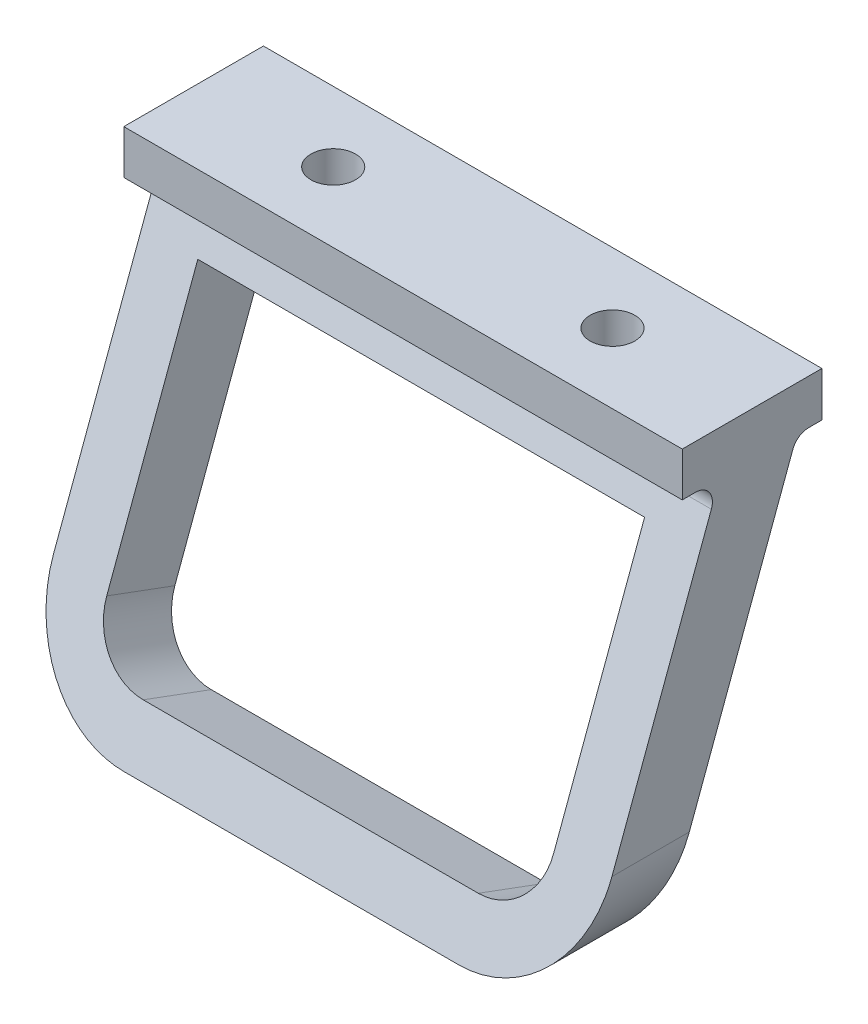
ISO-10303-21;
HEADER;
FILE_DESCRIPTION(('STEP AP214'),'2;1');
FILE_NAME('part.step','',(''),(''),'','','');
FILE_SCHEMA(('AUTOMOTIVE_DESIGN { 1 0 10303 214 1 1 1 1 }'));
ENDSEC;
DATA;
#1=APPLICATION_CONTEXT('core data for automotive mechanical design processes');
#2=APPLICATION_PROTOCOL_DEFINITION('international standard','automotive_design',2000,#1);
#3=PRODUCT_CONTEXT('',#1,'mechanical');
#4=PRODUCT('Part','Part','',(#3));
#5=PRODUCT_RELATED_PRODUCT_CATEGORY('part','',(#4));
#6=PRODUCT_DEFINITION_FORMATION('','',#4);
#7=PRODUCT_DEFINITION_CONTEXT('part definition',#1,'design');
#8=PRODUCT_DEFINITION('design','',#6,#7);
#9=PRODUCT_DEFINITION_SHAPE('','',#8);
#10=(LENGTH_UNIT() NAMED_UNIT(*) SI_UNIT(.MILLI.,.METRE.));
#11=(NAMED_UNIT(*) PLANE_ANGLE_UNIT() SI_UNIT($,.RADIAN.));
#12=(NAMED_UNIT(*) SI_UNIT($,.STERADIAN.) SOLID_ANGLE_UNIT());
#13=UNCERTAINTY_MEASURE_WITH_UNIT(LENGTH_MEASURE(1.E-05),#10,'distance_accuracy_value','');
#14=(GEOMETRIC_REPRESENTATION_CONTEXT(3) GLOBAL_UNCERTAINTY_ASSIGNED_CONTEXT((#13)) GLOBAL_UNIT_ASSIGNED_CONTEXT((#10,
#11,#12)) REPRESENTATION_CONTEXT('',''));
#15=CARTESIAN_POINT('',(0.,0.,0.));
#16=DIRECTION('',(0.,0.,1.));
#17=DIRECTION('',(1.,0.,0.));
#18=AXIS2_PLACEMENT_3D('',#15,#16,#17);
#19=CARTESIAN_POINT('',(20.,20.,0.));
#20=DIRECTION('',(0.,0.,-1.));
#21=DIRECTION('',(0.,1.,0.));
#22=AXIS2_PLACEMENT_3D('',#19,#20,#21);
#23=CYLINDRICAL_SURFACE('',#22,20.);
#24=DIRECTION('',(0.,0.,1.));
#25=VECTOR('',#24,1.);
#26=CARTESIAN_POINT('',(0.,20.,0.));
#27=LINE('',#26,#25);
#28=CARTESIAN_POINT('',(0.,20.,-21.2677631764187));
#29=VERTEX_POINT('',#28);
#30=CARTESIAN_POINT('',(0.,20.,-7.40525976007196));
#31=VERTEX_POINT('',#30);
#32=EDGE_CURVE('E379',#29,#31,#27,.T.);
#33=ORIENTED_EDGE('',*,*,#32,.F.);
#34=CARTESIAN_POINT('',(20.,20.,-21.2677631764187));
#35=DIRECTION('',(0.,-0.347225800382546,-0.937781554280473));
#36=DIRECTION('',(0.,0.937781554280473,-0.347225800382546));
#37=AXIS2_PLACEMENT_3D('',#34,#35,#36);
#38=ELLIPSE('',#37,21.3269283328411,20.);
#39=CARTESIAN_POINT('',(20.,0.,-13.8625034163467));
#40=VERTEX_POINT('',#39);
#41=EDGE_CURVE('E55',#40,#29,#38,.T.);
#42=ORIENTED_EDGE('',*,*,#41,.F.);
#43=DIRECTION('',(0.,0.,1.));
#44=VECTOR('',#43,1.);
#45=CARTESIAN_POINT('',(20.,0.,0.));
#46=LINE('',#45,#44);
#47=CARTESIAN_POINT('',(20.,0.,0.));
#48=VERTEX_POINT('',#47);
#49=EDGE_CURVE('E383',#48,#40,#46,.F.);
#50=ORIENTED_EDGE('',*,*,#49,.F.);
#51=CARTESIAN_POINT('',(20.,20.,-7.40525976007196));
#52=DIRECTION('',(0.,0.347225800382546,0.937781554280473));
#53=DIRECTION('',(0.,0.937781554280473,-0.347225800382546));
#54=AXIS2_PLACEMENT_3D('',#51,#52,#53);
#55=ELLIPSE('',#54,21.3269283328411,20.);
#56=EDGE_CURVE('E11',#31,#48,#55,.T.);
#57=ORIENTED_EDGE('',*,*,#56,.F.);
#58=EDGE_LOOP('',(#33,#42,#50,#57));
#59=FACE_BOUND('',#58,.T.);
#60=ADVANCED_FACE('F47',(#59),#23,.T.);
#61=CARTESIAN_POINT('',(80.,20.,0.));
#62=DIRECTION('',(0.,0.,-1.));
#63=DIRECTION('',(0.,1.,0.));
#64=AXIS2_PLACEMENT_3D('',#61,#62,#63);
#65=CYLINDRICAL_SURFACE('',#64,20.);
#66=DIRECTION('',(0.,0.,-1.));
#67=VECTOR('',#66,1.);
#68=CARTESIAN_POINT('',(100.,20.,0.));
#69=LINE('',#68,#67);
#70=CARTESIAN_POINT('',(100.,20.,-7.40525976007196));
#71=VERTEX_POINT('',#70);
#72=CARTESIAN_POINT('',(100.,20.,-21.2677631764187));
#73=VERTEX_POINT('',#72);
#74=EDGE_CURVE('E365',#71,#73,#69,.T.);
#75=ORIENTED_EDGE('',*,*,#74,.F.);
#76=CARTESIAN_POINT('',(80.,20.,-7.40525976007196));
#77=DIRECTION('',(0.,0.347225800382546,0.937781554280473));
#78=DIRECTION('',(0.,0.937781554280473,-0.347225800382546));
#79=AXIS2_PLACEMENT_3D('',#76,#77,#78);
#80=ELLIPSE('',#79,21.3269283328411,20.);
#81=CARTESIAN_POINT('',(80.,0.,0.));
#82=VERTEX_POINT('',#81);
#83=EDGE_CURVE('E373',#82,#71,#80,.T.);
#84=ORIENTED_EDGE('',*,*,#83,.F.);
#85=DIRECTION('',(0.,0.,-1.));
#86=VECTOR('',#85,1.);
#87=CARTESIAN_POINT('',(80.,0.,0.));
#88=LINE('',#87,#86);
#89=CARTESIAN_POINT('',(80.,0.,-13.8625034163467));
#90=VERTEX_POINT('',#89);
#91=EDGE_CURVE('E369',#90,#82,#88,.F.);
#92=ORIENTED_EDGE('',*,*,#91,.F.);
#93=CARTESIAN_POINT('',(80.,20.,-21.2677631764187));
#94=DIRECTION('',(0.,-0.347225800382546,-0.937781554280473));
#95=DIRECTION('',(0.,0.937781554280473,-0.347225800382546));
#96=AXIS2_PLACEMENT_3D('',#93,#94,#95);
#97=ELLIPSE('',#96,21.3269283328411,20.);
#98=EDGE_CURVE('E376',#73,#90,#97,.T.);
#99=ORIENTED_EDGE('',*,*,#98,.F.);
#100=EDGE_LOOP('',(#75,#84,#92,#99));
#101=FACE_BOUND('',#100,.T.);
#102=ADVANCED_FACE('F412',(#101),#65,.T.);
#103=CARTESIAN_POINT('',(100.,-4.5139354049731,-12.1911602056462));
#104=DIRECTION('',(0.,-0.347225800382546,-0.937781554280473));
#105=DIRECTION('',(0.,0.937781554280473,-0.347225800382546));
#106=AXIS2_PLACEMENT_3D('',#103,#104,#105);
#107=PLANE('',#106);
#108=DIRECTION('',(-1.,0.,0.));
#109=VECTOR('',#108,1.);
#110=CARTESIAN_POINT('',(90.,58.2865197800964,-35.443844390456));
#111=LINE('',#110,#109);
#112=CARTESIAN_POINT('',(90.,58.2865197800964,-35.443844390456));
#113=VERTEX_POINT('',#112);
#114=CARTESIAN_POINT('',(9.99999999999999,58.2865197800963,-35.443844390456));
#115=VERTEX_POINT('',#114);
#116=EDGE_CURVE('E217',#113,#115,#111,.T.);
#117=ORIENTED_EDGE('',*,*,#116,.T.);
#118=DIRECTION('',(0.,-0.937781554280473,0.347225800382546));
#119=VECTOR('',#118,1.);
#120=CARTESIAN_POINT('',(9.99999999999999,58.2865197800963,-35.443844390456));
#121=LINE('',#120,#119);
#122=CARTESIAN_POINT('',(10.,14.2416956806364,-19.1356762132971));
#123=VERTEX_POINT('',#122);
#124=EDGE_CURVE('E246',#115,#123,#121,.T.);
#125=ORIENTED_EDGE('',*,*,#124,.T.);
#126=CARTESIAN_POINT('',(20.,14.2416956806364,-19.1356762132971));
#127=DIRECTION('',(0.,-0.347225800382546,-0.937781554280473));
#128=DIRECTION('',(0.,0.937781554280473,-0.347225800382546));
#129=AXIS2_PLACEMENT_3D('',#126,#127,#128);
#130=CIRCLE('',#129,10.);
#131=CARTESIAN_POINT('',(20.0000000000001,4.86388013783163,-15.6634182094716));
#132=VERTEX_POINT('',#131);
#133=EDGE_CURVE('E201',#123,#132,#130,.F.);
#134=ORIENTED_EDGE('',*,*,#133,.T.);
#135=DIRECTION('',(1.,0.,0.));
#136=VECTOR('',#135,1.);
#137=CARTESIAN_POINT('',(20.0000000000001,4.86388013783163,-15.6634182094716));
#138=LINE('',#137,#136);
#139=CARTESIAN_POINT('',(79.9999999999999,4.86388013783163,-15.6634182094716));
#140=VERTEX_POINT('',#139);
#141=EDGE_CURVE('E205',#132,#140,#138,.T.);
#142=ORIENTED_EDGE('',*,*,#141,.T.);
#143=CARTESIAN_POINT('',(80.,14.2416956806364,-19.1356762132971));
#144=DIRECTION('',(0.,-0.347225800382546,-0.937781554280473));
#145=DIRECTION('',(0.,0.937781554280473,-0.347225800382546));
#146=AXIS2_PLACEMENT_3D('',#143,#144,#145);
#147=CIRCLE('',#146,10.);
#148=CARTESIAN_POINT('',(90.,14.2416956806364,-19.1356762132971));
#149=VERTEX_POINT('',#148);
#150=EDGE_CURVE('E209',#140,#149,#147,.F.);
#151=ORIENTED_EDGE('',*,*,#150,.T.);
#152=DIRECTION('',(0.,0.937781554280473,-0.347225800382546));
#153=VECTOR('',#152,1.);
#154=CARTESIAN_POINT('',(90.,14.2416956806364,-19.1356762132971));
#155=LINE('',#154,#153);
#156=EDGE_CURVE('E213',#149,#113,#155,.T.);
#157=ORIENTED_EDGE('',*,*,#156,.T.);
#158=EDGE_LOOP('',(#117,#125,#134,#142,#151,#157));
#159=FACE_BOUND('',#158,.T.);
#160=DIRECTION('',(-1.,0.,0.));
#161=VECTOR('',#160,1.);
#162=CARTESIAN_POINT('',(100.,0.,-13.8625034163467));
#163=LINE('',#162,#161);
#164=EDGE_CURVE('E299',#90,#40,#163,.T.);
#165=ORIENTED_EDGE('',*,*,#164,.T.);
#166=ORIENTED_EDGE('',*,*,#41,.T.);
#167=DIRECTION('',(0.,-0.937781554280473,0.347225800382546));
#168=VECTOR('',#167,1.);
#169=CARTESIAN_POINT('',(0.,-4.5139354049731,-12.1911602056462));
#170=LINE('',#169,#168);
#171=CARTESIAN_POINT('',(0.,70.0416774011477,-39.7963441756797));
#172=VERTEX_POINT('',#171);
#173=EDGE_CURVE('E263',#172,#29,#170,.T.);
#174=ORIENTED_EDGE('',*,*,#173,.F.);
#175=DIRECTION('',(-1.,0.,0.));
#176=VECTOR('',#175,1.);
#177=CARTESIAN_POINT('',(100.,70.0416774011477,-39.7963441756797));
#178=LINE('',#177,#176);
#179=CARTESIAN_POINT('',(100.,70.0416774011477,-39.7963441756797));
#180=VERTEX_POINT('',#179);
#181=EDGE_CURVE('E362',#180,#172,#178,.T.);
#182=ORIENTED_EDGE('',*,*,#181,.F.);
#183=DIRECTION('',(0.,-0.937781554280473,0.347225800382546));
#184=VECTOR('',#183,1.);
#185=CARTESIAN_POINT('',(100.,-4.5139354049731,-12.1911602056462));
#186=LINE('',#185,#184);
#187=EDGE_CURVE('E264',#180,#73,#186,.T.);
#188=ORIENTED_EDGE('',*,*,#187,.T.);
#189=ORIENTED_EDGE('',*,*,#98,.T.);
#190=EDGE_LOOP('',(#165,#166,#174,#182,#188,#189));
#191=FACE_BOUND('',#190,.T.);
#192=ADVANCED_FACE('F390',(#159,#191),#107,.T.);
#193=CARTESIAN_POINT('',(100.,69.,-42.6096888385212));
#194=DIRECTION('',(-1.,0.,0.));
#195=DIRECTION('',(0.,0.,1.));
#196=AXIS2_PLACEMENT_3D('',#193,#194,#195);
#197=CYLINDRICAL_SURFACE('',#196,3.00000000000001);
#198=CARTESIAN_POINT('',(0.,69.,-42.6096888385212));
#199=DIRECTION('',(1.,0.,0.));
#200=DIRECTION('',(0.,0.,-1.));
#201=AXIS2_PLACEMENT_3D('',#198,#199,#200);
#202=CIRCLE('',#201,3.00000000000001);
#203=CARTESIAN_POINT('',(0.,72.,-42.6096888385212));
#204=VERTEX_POINT('',#203);
#205=EDGE_CURVE('E303',#172,#204,#202,.F.);
#206=ORIENTED_EDGE('',*,*,#205,.T.);
#207=DIRECTION('',(-1.,0.,0.));
#208=VECTOR('',#207,1.);
#209=CARTESIAN_POINT('',(100.,72.,-42.6096888385212));
#210=LINE('',#209,#208);
#211=CARTESIAN_POINT('',(100.,72.,-42.6096888385212));
#212=VERTEX_POINT('',#211);
#213=EDGE_CURVE('E359',#212,#204,#210,.T.);
#214=ORIENTED_EDGE('',*,*,#213,.F.);
#215=CARTESIAN_POINT('',(100.,69.,-42.6096888385212));
#216=DIRECTION('',(1.,0.,0.));
#217=DIRECTION('',(0.,0.,-1.));
#218=AXIS2_PLACEMENT_3D('',#215,#216,#217);
#219=CIRCLE('',#218,3.00000000000001);
#220=EDGE_CURVE('E268',#180,#212,#219,.F.);
#221=ORIENTED_EDGE('',*,*,#220,.F.);
#222=ORIENTED_EDGE('',*,*,#181,.T.);
#223=EDGE_LOOP('',(#206,#214,#221,#222));
#224=FACE_BOUND('',#223,.T.);
#225=ADVANCED_FACE('F401',(#224),#197,.F.);
#226=CARTESIAN_POINT('',(100.,72.,0.));
#227=DIRECTION('',(0.,-1.,0.));
#228=DIRECTION('',(0.,0.,-1.));
#229=AXIS2_PLACEMENT_3D('',#226,#227,#228);
#230=PLANE('',#229);
#231=DIRECTION('',(0.,0.,1.));
#232=VECTOR('',#231,1.);
#233=CARTESIAN_POINT('',(0.,72.,0.));
#234=LINE('',#233,#232);
#235=CARTESIAN_POINT('',(0.,72.,-45.));
#236=VERTEX_POINT('',#235);
#237=EDGE_CURVE('E307',#236,#204,#234,.T.);
#238=ORIENTED_EDGE('',*,*,#237,.F.);
#239=DIRECTION('',(-1.,0.,0.));
#240=VECTOR('',#239,1.);
#241=CARTESIAN_POINT('',(100.,72.,-45.));
#242=LINE('',#241,#240);
#243=CARTESIAN_POINT('',(100.,72.,-45.));
#244=VERTEX_POINT('',#243);
#245=EDGE_CURVE('E356',#244,#236,#242,.T.);
#246=ORIENTED_EDGE('',*,*,#245,.F.);
#247=DIRECTION('',(0.,0.,1.));
#248=VECTOR('',#247,1.);
#249=CARTESIAN_POINT('',(100.,72.,0.));
#250=LINE('',#249,#248);
#251=EDGE_CURVE('E272',#244,#212,#250,.T.);
#252=ORIENTED_EDGE('',*,*,#251,.T.);
#253=ORIENTED_EDGE('',*,*,#213,.T.);
#254=EDGE_LOOP('',(#238,#246,#252,#253));
#255=FACE_BOUND('',#254,.T.);
#256=ADVANCED_FACE('F439',(#255),#230,.T.);
#257=CARTESIAN_POINT('',(100.,0.,-44.9999999999999));
#258=DIRECTION('',(0.,0.,-1.));
#259=DIRECTION('',(0.,1.,0.));
#260=AXIS2_PLACEMENT_3D('',#257,#258,#259);
#261=PLANE('',#260);
#262=DIRECTION('',(0.,-1.,0.));
#263=VECTOR('',#262,1.);
#264=CARTESIAN_POINT('',(0.,0.,-44.9999999999999));
#265=LINE('',#264,#263);
#266=CARTESIAN_POINT('',(0.,80.,-45.));
#267=VERTEX_POINT('',#266);
#268=EDGE_CURVE('E311',#267,#236,#265,.T.);
#269=ORIENTED_EDGE('',*,*,#268,.F.);
#270=DIRECTION('',(-1.,0.,0.));
#271=VECTOR('',#270,1.);
#272=CARTESIAN_POINT('',(100.,80.,-45.));
#273=LINE('',#272,#271);
#274=CARTESIAN_POINT('',(100.,80.,-45.));
#275=VERTEX_POINT('',#274);
#276=EDGE_CURVE('E353',#275,#267,#273,.T.);
#277=ORIENTED_EDGE('',*,*,#276,.F.);
#278=DIRECTION('',(0.,-1.,0.));
#279=VECTOR('',#278,1.);
#280=CARTESIAN_POINT('',(100.,0.,-44.9999999999999));
#281=LINE('',#280,#279);
#282=EDGE_CURVE('E276',#275,#244,#281,.T.);
#283=ORIENTED_EDGE('',*,*,#282,.T.);
#284=ORIENTED_EDGE('',*,*,#245,.T.);
#285=EDGE_LOOP('',(#269,#277,#283,#284));
#286=FACE_BOUND('',#285,.T.);
#287=ADVANCED_FACE('F437',(#286),#261,.T.);
#288=CARTESIAN_POINT('',(100.,80.,0.));
#289=DIRECTION('',(0.,1.,0.));
#290=DIRECTION('',(0.,0.,1.));
#291=AXIS2_PLACEMENT_3D('',#288,#289,#290);
#292=PLANE('',#291);
#293=CARTESIAN_POINT('',(25.,80.,-32.5));
#294=DIRECTION('',(0.,1.,0.));
#295=DIRECTION('',(0.,0.,1.));
#296=AXIS2_PLACEMENT_3D('',#293,#294,#295);
#297=CIRCLE('',#296,4.);
#298=CARTESIAN_POINT('',(25.,80.,-28.5));
#299=VERTEX_POINT('',#298);
#300=EDGE_CURVE('E188',#299,#299,#297,.T.);
#301=ORIENTED_EDGE('',*,*,#300,.F.);
#302=EDGE_LOOP('',(#301));
#303=FACE_BOUND('',#302,.T.);
#304=CARTESIAN_POINT('',(75.,80.,-32.5));
#305=DIRECTION('',(0.,1.,0.));
#306=DIRECTION('',(0.,0.,1.));
#307=AXIS2_PLACEMENT_3D('',#304,#305,#306);
#308=CIRCLE('',#307,4.);
#309=CARTESIAN_POINT('',(75.,80.,-28.5));
#310=VERTEX_POINT('',#309);
#311=EDGE_CURVE('E187',#310,#310,#308,.T.);
#312=ORIENTED_EDGE('',*,*,#311,.F.);
#313=EDGE_LOOP('',(#312));
#314=FACE_BOUND('',#313,.T.);
#315=DIRECTION('',(0.,0.,-1.));
#316=VECTOR('',#315,1.);
#317=CARTESIAN_POINT('',(0.,80.,0.));
#318=LINE('',#317,#316);
#319=CARTESIAN_POINT('',(0.,80.,-20.));
#320=VERTEX_POINT('',#319);
#321=EDGE_CURVE('E315',#320,#267,#318,.T.);
#322=ORIENTED_EDGE('',*,*,#321,.F.);
#323=DIRECTION('',(-1.,0.,0.));
#324=VECTOR('',#323,1.);
#325=CARTESIAN_POINT('',(100.,80.,-20.));
#326=LINE('',#325,#324);
#327=CARTESIAN_POINT('',(100.,80.,-20.));
#328=VERTEX_POINT('',#327);
#329=EDGE_CURVE('E350',#328,#320,#326,.T.);
#330=ORIENTED_EDGE('',*,*,#329,.F.);
#331=DIRECTION('',(0.,0.,-1.));
#332=VECTOR('',#331,1.);
#333=CARTESIAN_POINT('',(100.,80.,0.));
#334=LINE('',#333,#332);
#335=EDGE_CURVE('E280',#328,#275,#334,.T.);
#336=ORIENTED_EDGE('',*,*,#335,.T.);
#337=ORIENTED_EDGE('',*,*,#276,.T.);
#338=EDGE_LOOP('',(#322,#330,#336,#337));
#339=FACE_BOUND('',#338,.T.);
#340=ADVANCED_FACE('F433',(#303,#314,#339),#292,.T.);
#341=CARTESIAN_POINT('',(100.,0.,-20.0000000000001));
#342=DIRECTION('',(0.,0.,1.));
#343=DIRECTION('',(0.,-1.,0.));
#344=AXIS2_PLACEMENT_3D('',#341,#342,#343);
#345=PLANE('',#344);
#346=DIRECTION('',(0.,1.,0.));
#347=VECTOR('',#346,1.);
#348=CARTESIAN_POINT('',(0.,0.,-20.0000000000001));
#349=LINE('',#348,#347);
#350=CARTESIAN_POINT('',(0.,72.1112837104753,-20.));
#351=VERTEX_POINT('',#350);
#352=EDGE_CURVE('E319',#351,#320,#349,.T.);
#353=ORIENTED_EDGE('',*,*,#352,.F.);
#354=DIRECTION('',(-1.,0.,0.));
#355=VECTOR('',#354,1.);
#356=CARTESIAN_POINT('',(100.,72.1112837104753,-20.));
#357=LINE('',#356,#355);
#358=CARTESIAN_POINT('',(100.,72.1112837104753,-20.));
#359=VERTEX_POINT('',#358);
#360=EDGE_CURVE('E347',#359,#351,#357,.T.);
#361=ORIENTED_EDGE('',*,*,#360,.F.);
#362=DIRECTION('',(0.,1.,0.));
#363=VECTOR('',#362,1.);
#364=CARTESIAN_POINT('',(100.,0.,-20.0000000000001));
#365=LINE('',#364,#363);
#366=EDGE_CURVE('E284',#359,#328,#365,.T.);
#367=ORIENTED_EDGE('',*,*,#366,.T.);
#368=ORIENTED_EDGE('',*,*,#329,.T.);
#369=EDGE_LOOP('',(#353,#361,#367,#368));
#370=FACE_BOUND('',#369,.T.);
#371=ADVANCED_FACE('F429',(#370),#345,.T.);
#372=CARTESIAN_POINT('',(100.,72.1112837104753,0.));
#373=DIRECTION('',(0.,-1.,0.));
#374=DIRECTION('',(0.,0.,-1.));
#375=AXIS2_PLACEMENT_3D('',#372,#373,#374);
#376=PLANE('',#375);
#377=DIRECTION('',(0.,0.,1.));
#378=VECTOR('',#377,1.);
#379=CARTESIAN_POINT('',(0.,72.1112837104753,0.));
#380=LINE('',#379,#378);
#381=CARTESIAN_POINT('',(0.,72.1112837104753,-22.3903111614788));
#382=VERTEX_POINT('',#381);
#383=EDGE_CURVE('E323',#382,#351,#380,.T.);
#384=ORIENTED_EDGE('',*,*,#383,.F.);
#385=DIRECTION('',(-1.,0.,0.));
#386=VECTOR('',#385,1.);
#387=CARTESIAN_POINT('',(100.,72.1112837104753,-22.3903111614788));
#388=LINE('',#387,#386);
#389=CARTESIAN_POINT('',(100.,72.1112837104753,-22.3903111614788));
#390=VERTEX_POINT('',#389);
#391=EDGE_CURVE('E344',#390,#382,#388,.T.);
#392=ORIENTED_EDGE('',*,*,#391,.F.);
#393=DIRECTION('',(0.,0.,1.));
#394=VECTOR('',#393,1.);
#395=CARTESIAN_POINT('',(100.,72.1112837104753,0.));
#396=LINE('',#395,#394);
#397=EDGE_CURVE('E288',#390,#359,#396,.T.);
#398=ORIENTED_EDGE('',*,*,#397,.T.);
#399=ORIENTED_EDGE('',*,*,#360,.T.);
#400=EDGE_LOOP('',(#384,#392,#398,#399));
#401=FACE_BOUND('',#400,.T.);
#402=ADVANCED_FACE('F425',(#401),#376,.T.);
#403=CARTESIAN_POINT('',(100.,69.1112837104753,-22.3903111614788));
#404=DIRECTION('',(-1.,0.,0.));
#405=DIRECTION('',(0.,0.,1.));
#406=AXIS2_PLACEMENT_3D('',#403,#404,#405);
#407=CYLINDRICAL_SURFACE('',#406,3.);
#408=CARTESIAN_POINT('',(0.,69.1112837104753,-22.3903111614788));
#409=DIRECTION('',(1.,0.,0.));
#410=DIRECTION('',(0.,0.,-1.));
#411=AXIS2_PLACEMENT_3D('',#408,#409,#410);
#412=CIRCLE('',#411,3.);
#413=CARTESIAN_POINT('',(0.,68.0696063093277,-25.2036558243202));
#414=VERTEX_POINT('',#413);
#415=EDGE_CURVE('E327',#414,#382,#412,.T.);
#416=ORIENTED_EDGE('',*,*,#415,.F.);
#417=DIRECTION('',(-1.,0.,0.));
#418=VECTOR('',#417,1.);
#419=CARTESIAN_POINT('',(100.,68.0696063093277,-25.2036558243202));
#420=LINE('',#419,#418);
#421=CARTESIAN_POINT('',(100.,68.0696063093277,-25.2036558243202));
#422=VERTEX_POINT('',#421);
#423=EDGE_CURVE('E340',#422,#414,#420,.T.);
#424=ORIENTED_EDGE('',*,*,#423,.F.);
#425=CARTESIAN_POINT('',(100.,69.1112837104753,-22.3903111614788));
#426=DIRECTION('',(1.,0.,0.));
#427=DIRECTION('',(0.,0.,-1.));
#428=AXIS2_PLACEMENT_3D('',#425,#426,#427);
#429=CIRCLE('',#428,3.);
#430=EDGE_CURVE('E292',#422,#390,#429,.T.);
#431=ORIENTED_EDGE('',*,*,#430,.T.);
#432=ORIENTED_EDGE('',*,*,#391,.T.);
#433=EDGE_LOOP('',(#416,#424,#431,#432));
#434=FACE_BOUND('',#433,.T.);
#435=ADVANCED_FACE('F422',(#434),#407,.F.);
#436=CARTESIAN_POINT('',(100.,0.,0.));
#437=DIRECTION('',(0.,0.347225800382546,0.937781554280473));
#438=DIRECTION('',(0.,-0.937781554280473,0.347225800382546));
#439=AXIS2_PLACEMENT_3D('',#436,#437,#438);
#440=PLANE('',#439);
#441=DIRECTION('',(-1.,0.,0.));
#442=VECTOR('',#441,1.);
#443=CARTESIAN_POINT('',(90.,62.8004551850695,-23.2526841848099));
#444=LINE('',#443,#442);
#445=CARTESIAN_POINT('',(90.,62.8004551850695,-23.2526841848099));
#446=VERTEX_POINT('',#445);
#447=CARTESIAN_POINT('',(9.99999999999999,62.8004551850694,-23.2526841848098));
#448=VERTEX_POINT('',#447);
#449=EDGE_CURVE('E70',#446,#448,#444,.T.);
#450=ORIENTED_EDGE('',*,*,#449,.F.);
#451=DIRECTION('',(0.,0.937781554280473,-0.347225800382546));
#452=VECTOR('',#451,1.);
#453=CARTESIAN_POINT('',(90.,18.7556310856095,-6.94451600765095));
#454=LINE('',#453,#452);
#455=CARTESIAN_POINT('',(90.,18.7556310856095,-6.94451600765095));
#456=VERTEX_POINT('',#455);
#457=EDGE_CURVE('E238',#456,#446,#454,.T.);
#458=ORIENTED_EDGE('',*,*,#457,.F.);
#459=CARTESIAN_POINT('',(80.,18.7556310856095,-6.94451600765093));
#460=DIRECTION('',(0.,0.347225800382546,0.937781554280473));
#461=DIRECTION('',(0.,-0.937781554280473,0.347225800382546));
#462=AXIS2_PLACEMENT_3D('',#459,#460,#461);
#463=CIRCLE('',#462,10.);
#464=CARTESIAN_POINT('',(79.9999999999999,9.37781554280473,-3.47225800382546));
#465=VERTEX_POINT('',#464);
#466=EDGE_CURVE('E234',#465,#456,#463,.T.);
#467=ORIENTED_EDGE('',*,*,#466,.F.);
#468=DIRECTION('',(1.,0.,0.));
#469=VECTOR('',#468,1.);
#470=CARTESIAN_POINT('',(20.0000000000001,9.37781554280473,-3.47225800382546));
#471=LINE('',#470,#469);
#472=CARTESIAN_POINT('',(20.0000000000001,9.37781554280473,-3.47225800382546));
#473=VERTEX_POINT('',#472);
#474=EDGE_CURVE('E230',#473,#465,#471,.T.);
#475=ORIENTED_EDGE('',*,*,#474,.F.);
#476=CARTESIAN_POINT('',(20.,18.7556310856095,-6.94451600765093));
#477=DIRECTION('',(0.,0.347225800382546,0.937781554280473));
#478=DIRECTION('',(0.,0.937781554280473,-0.347225800382546));
#479=AXIS2_PLACEMENT_3D('',#476,#477,#478);
#480=CIRCLE('',#479,10.);
#481=CARTESIAN_POINT('',(10.,18.7556310856095,-6.94451600765095));
#482=VERTEX_POINT('',#481);
#483=EDGE_CURVE('E226',#482,#473,#480,.T.);
#484=ORIENTED_EDGE('',*,*,#483,.F.);
#485=DIRECTION('',(0.,-0.937781554280473,0.347225800382546));
#486=VECTOR('',#485,1.);
#487=CARTESIAN_POINT('',(9.99999999999999,62.8004551850694,-23.2526841848099));
#488=LINE('',#487,#486);
#489=EDGE_CURVE('E223',#448,#482,#488,.T.);
#490=ORIENTED_EDGE('',*,*,#489,.F.);
#491=EDGE_LOOP('',(#450,#458,#467,#475,#484,#490));
#492=FACE_BOUND('',#491,.T.);
#493=DIRECTION('',(0.,0.937781554280473,-0.347225800382546));
#494=VECTOR('',#493,1.);
#495=CARTESIAN_POINT('',(0.,0.,0.));
#496=LINE('',#495,#494);
#497=EDGE_CURVE('E269',#31,#414,#496,.T.);
#498=ORIENTED_EDGE('',*,*,#497,.F.);
#499=ORIENTED_EDGE('',*,*,#56,.T.);
#500=DIRECTION('',(-1.,0.,0.));
#501=VECTOR('',#500,1.);
#502=CARTESIAN_POINT('',(100.,0.,0.));
#503=LINE('',#502,#501);
#504=EDGE_CURVE('E336',#82,#48,#503,.T.);
#505=ORIENTED_EDGE('',*,*,#504,.F.);
#506=ORIENTED_EDGE('',*,*,#83,.T.);
#507=DIRECTION('',(0.,0.937781554280473,-0.347225800382546));
#508=VECTOR('',#507,1.);
#509=CARTESIAN_POINT('',(100.,0.,0.));
#510=LINE('',#509,#508);
#511=EDGE_CURVE('E296',#71,#422,#510,.T.);
#512=ORIENTED_EDGE('',*,*,#511,.T.);
#513=ORIENTED_EDGE('',*,*,#423,.T.);
#514=EDGE_LOOP('',(#498,#499,#505,#506,#512,#513));
#515=FACE_BOUND('',#514,.T.);
#516=ADVANCED_FACE('F417',(#492,#515),#440,.T.);
#517=CARTESIAN_POINT('',(100.,0.,0.));
#518=DIRECTION('',(0.,-1.,0.));
#519=DIRECTION('',(0.,0.,-1.));
#520=AXIS2_PLACEMENT_3D('',#517,#518,#519);
#521=PLANE('',#520);
#522=ORIENTED_EDGE('',*,*,#504,.T.);
#523=ORIENTED_EDGE('',*,*,#49,.T.);
#524=ORIENTED_EDGE('',*,*,#164,.F.);
#525=ORIENTED_EDGE('',*,*,#91,.T.);
#526=EDGE_LOOP('',(#522,#523,#524,#525));
#527=FACE_BOUND('',#526,.T.);
#528=ADVANCED_FACE('F415',(#527),#521,.T.);
#529=CARTESIAN_POINT('',(100.,0.,0.));
#530=DIRECTION('',(1.,0.,0.));
#531=DIRECTION('',(0.,0.,-1.));
#532=AXIS2_PLACEMENT_3D('',#529,#530,#531);
#533=PLANE('',#532);
#534=ORIENTED_EDGE('',*,*,#511,.F.);
#535=ORIENTED_EDGE('',*,*,#74,.T.);
#536=ORIENTED_EDGE('',*,*,#187,.F.);
#537=ORIENTED_EDGE('',*,*,#220,.T.);
#538=ORIENTED_EDGE('',*,*,#251,.F.);
#539=ORIENTED_EDGE('',*,*,#282,.F.);
#540=ORIENTED_EDGE('',*,*,#335,.F.);
#541=ORIENTED_EDGE('',*,*,#366,.F.);
#542=ORIENTED_EDGE('',*,*,#397,.F.);
#543=ORIENTED_EDGE('',*,*,#430,.F.);
#544=EDGE_LOOP('',(#534,#535,#536,#537,#538,#539,#540,#541,#542,#543));
#545=FACE_BOUND('',#544,.T.);
#546=ADVANCED_FACE('F407',(#545),#533,.T.);
#547=CARTESIAN_POINT('',(0.,0.,0.));
#548=DIRECTION('',(1.,0.,0.));
#549=DIRECTION('',(0.,0.,-1.));
#550=AXIS2_PLACEMENT_3D('',#547,#548,#549);
#551=PLANE('',#550);
#552=ORIENTED_EDGE('',*,*,#173,.T.);
#553=ORIENTED_EDGE('',*,*,#32,.T.);
#554=ORIENTED_EDGE('',*,*,#497,.T.);
#555=ORIENTED_EDGE('',*,*,#415,.T.);
#556=ORIENTED_EDGE('',*,*,#383,.T.);
#557=ORIENTED_EDGE('',*,*,#352,.T.);
#558=ORIENTED_EDGE('',*,*,#321,.T.);
#559=ORIENTED_EDGE('',*,*,#268,.T.);
#560=ORIENTED_EDGE('',*,*,#237,.T.);
#561=ORIENTED_EDGE('',*,*,#205,.F.);
#562=EDGE_LOOP('',(#552,#553,#554,#555,#556,#557,#558,#559,#560,#561));
#563=FACE_BOUND('',#562,.T.);
#564=ADVANCED_FACE('F397',(#563),#551,.F.);
#565=CARTESIAN_POINT('',(90.,48.1470212127561,-62.8284302006957));
#566=DIRECTION('',(0.,0.937781554280473,-0.347225800382546));
#567=DIRECTION('',(0.,0.347225800382546,0.937781554280473));
#568=AXIS2_PLACEMENT_3D('',#565,#566,#567);
#569=PLANE('',#568);
#570=DIRECTION('',(0.,0.347225800382546,0.937781554280473));
#571=VECTOR('',#570,1.);
#572=CARTESIAN_POINT('',(90.,48.1470212127561,-62.8284302006957));
#573=LINE('',#572,#571);
#574=EDGE_CURVE('E243',#113,#446,#573,.T.);
#575=ORIENTED_EDGE('',*,*,#574,.T.);
#576=ORIENTED_EDGE('',*,*,#449,.T.);
#577=DIRECTION('',(0.,0.347225800382546,0.937781554280473));
#578=VECTOR('',#577,1.);
#579=CARTESIAN_POINT('',(9.99999999999999,48.1470212127561,-62.8284302006957));
#580=LINE('',#579,#578);
#581=EDGE_CURVE('E242',#115,#448,#580,.T.);
#582=ORIENTED_EDGE('',*,*,#581,.F.);
#583=ORIENTED_EDGE('',*,*,#116,.F.);
#584=EDGE_LOOP('',(#575,#576,#582,#583));
#585=FACE_BOUND('',#584,.T.);
#586=ADVANCED_FACE('F465',(#585),#569,.F.);
#587=CARTESIAN_POINT('',(90.,4.10219711329617,-46.5202620235368));
#588=DIRECTION('',(1.,0.,0.));
#589=DIRECTION('',(0.,1.,0.));
#590=AXIS2_PLACEMENT_3D('',#587,#588,#589);
#591=PLANE('',#590);
#592=DIRECTION('',(0.,0.347225800382546,0.937781554280473));
#593=VECTOR('',#592,1.);
#594=CARTESIAN_POINT('',(90.,4.10219711329616,-46.5202620235368));
#595=LINE('',#594,#593);
#596=EDGE_CURVE('E247',#149,#456,#595,.T.);
#597=ORIENTED_EDGE('',*,*,#596,.T.);
#598=ORIENTED_EDGE('',*,*,#457,.T.);
#599=ORIENTED_EDGE('',*,*,#574,.F.);
#600=ORIENTED_EDGE('',*,*,#156,.F.);
#601=EDGE_LOOP('',(#597,#598,#599,#600));
#602=FACE_BOUND('',#601,.T.);
#603=ADVANCED_FACE('F467',(#602),#591,.F.);
#604=CARTESIAN_POINT('',(80.,4.1021971132961,-46.5202620235368));
#605=DIRECTION('',(0.,0.347225800382546,0.937781554280473));
#606=DIRECTION('',(0.,-0.937781554280473,0.347225800382546));
#607=AXIS2_PLACEMENT_3D('',#604,#605,#606);
#608=CYLINDRICAL_SURFACE('',#607,10.);
#609=DIRECTION('',(0.,0.347225800382546,0.937781554280473));
#610=VECTOR('',#609,1.);
#611=CARTESIAN_POINT('',(79.9999999999999,-5.27561842950863,-43.0480040197113));
#612=LINE('',#611,#610);
#613=EDGE_CURVE('E250',#140,#465,#612,.T.);
#614=ORIENTED_EDGE('',*,*,#613,.T.);
#615=ORIENTED_EDGE('',*,*,#466,.T.);
#616=ORIENTED_EDGE('',*,*,#596,.F.);
#617=ORIENTED_EDGE('',*,*,#150,.F.);
#618=EDGE_LOOP('',(#614,#615,#616,#617));
#619=FACE_BOUND('',#618,.T.);
#620=ADVANCED_FACE('F520',(#619),#608,.F.);
#621=CARTESIAN_POINT('',(20.0000000000001,-5.27561842950863,-43.0480040197113));
#622=DIRECTION('',(0.,-0.937781554280473,0.347225800382546));
#623=DIRECTION('',(0.,-0.347225800382546,-0.937781554280473));
#624=AXIS2_PLACEMENT_3D('',#621,#622,#623);
#625=PLANE('',#624);
#626=DIRECTION('',(0.,0.347225800382546,0.937781554280473));
#627=VECTOR('',#626,1.);
#628=CARTESIAN_POINT('',(20.0000000000001,-5.27561842950863,-43.0480040197113));
#629=LINE('',#628,#627);
#630=EDGE_CURVE('E253',#132,#473,#629,.T.);
#631=ORIENTED_EDGE('',*,*,#630,.T.);
#632=ORIENTED_EDGE('',*,*,#474,.T.);
#633=ORIENTED_EDGE('',*,*,#613,.F.);
#634=ORIENTED_EDGE('',*,*,#141,.F.);
#635=EDGE_LOOP('',(#631,#632,#633,#634));
#636=FACE_BOUND('',#635,.T.);
#637=ADVANCED_FACE('F487',(#636),#625,.F.);
#638=CARTESIAN_POINT('',(20.,4.1021971132961,-46.5202620235368));
#639=DIRECTION('',(0.,0.347225800382546,0.937781554280473));
#640=DIRECTION('',(0.,-0.937781554280473,0.347225800382546));
#641=AXIS2_PLACEMENT_3D('',#638,#639,#640);
#642=CYLINDRICAL_SURFACE('',#641,10.);
#643=DIRECTION('',(0.,0.347225800382546,0.937781554280473));
#644=VECTOR('',#643,1.);
#645=CARTESIAN_POINT('',(10.,4.10219711329616,-46.5202620235368));
#646=LINE('',#645,#644);
#647=EDGE_CURVE('E62',#123,#482,#646,.T.);
#648=ORIENTED_EDGE('',*,*,#647,.T.);
#649=ORIENTED_EDGE('',*,*,#483,.T.);
#650=ORIENTED_EDGE('',*,*,#630,.F.);
#651=ORIENTED_EDGE('',*,*,#133,.F.);
#652=EDGE_LOOP('',(#648,#649,#650,#651));
#653=FACE_BOUND('',#652,.T.);
#654=ADVANCED_FACE('F478',(#653),#642,.F.);
#655=CARTESIAN_POINT('',(9.99999999999999,48.1470212127561,-62.8284302006957));
#656=DIRECTION('',(-1.,0.,0.));
#657=DIRECTION('',(0.,-1.,0.));
#658=AXIS2_PLACEMENT_3D('',#655,#656,#657);
#659=PLANE('',#658);
#660=ORIENTED_EDGE('',*,*,#581,.T.);
#661=ORIENTED_EDGE('',*,*,#489,.T.);
#662=ORIENTED_EDGE('',*,*,#647,.F.);
#663=ORIENTED_EDGE('',*,*,#124,.F.);
#664=EDGE_LOOP('',(#660,#661,#662,#663));
#665=FACE_BOUND('',#664,.T.);
#666=ADVANCED_FACE('F475',(#665),#659,.F.);
#667=CARTESIAN_POINT('',(75.,67.4034424761103,-32.5));
#668=DIRECTION('',(0.,1.,0.));
#669=DIRECTION('',(0.,0.,1.));
#670=AXIS2_PLACEMENT_3D('',#667,#668,#669);
#671=CONICAL_SURFACE('',#670,4.,1.02974425867666);
#672=CARTESIAN_POINT('',(75.,65.,-32.5));
#673=VERTEX_POINT('',#672);
#674=VERTEX_LOOP('',#673);
#675=FACE_BOUND('',#674,.T.);
#676=CARTESIAN_POINT('',(75.,67.4034424761103,-32.5));
#677=DIRECTION('',(0.,1.,0.));
#678=DIRECTION('',(0.,0.,1.));
#679=AXIS2_PLACEMENT_3D('',#676,#677,#678);
#680=CIRCLE('',#679,4.);
#681=CARTESIAN_POINT('',(75.,67.4034424761103,-28.5));
#682=VERTEX_POINT('',#681);
#683=EDGE_CURVE('E193',#682,#682,#680,.T.);
#684=ORIENTED_EDGE('',*,*,#683,.T.);
#685=EDGE_LOOP('',(#684));
#686=FACE_BOUND('',#685,.T.);
#687=ADVANCED_FACE('F477',(#675,#686),#671,.F.);
#688=CARTESIAN_POINT('',(75.,80.,-32.5));
#689=DIRECTION('',(0.,1.,0.));
#690=DIRECTION('',(0.,0.,1.));
#691=AXIS2_PLACEMENT_3D('',#688,#689,#690);
#692=CYLINDRICAL_SURFACE('',#691,4.);
#693=ORIENTED_EDGE('',*,*,#683,.F.);
#694=EDGE_LOOP('',(#693));
#695=FACE_BOUND('',#694,.T.);
#696=ORIENTED_EDGE('',*,*,#311,.T.);
#697=EDGE_LOOP('',(#696));
#698=FACE_BOUND('',#697,.T.);
#699=ADVANCED_FACE('F180',(#695,#698),#692,.F.);
#700=CARTESIAN_POINT('',(25.,67.4034424761103,-32.5));
#701=DIRECTION('',(0.,1.,0.));
#702=DIRECTION('',(0.,0.,1.));
#703=AXIS2_PLACEMENT_3D('',#700,#701,#702);
#704=CONICAL_SURFACE('',#703,4.,1.02974425867665);
#705=CARTESIAN_POINT('',(25.,65.,-32.5));
#706=VERTEX_POINT('',#705);
#707=VERTEX_LOOP('',#706);
#708=FACE_BOUND('',#707,.T.);
#709=CARTESIAN_POINT('',(25.,67.4034424761103,-32.5));
#710=DIRECTION('',(0.,1.,0.));
#711=DIRECTION('',(0.,0.,1.));
#712=AXIS2_PLACEMENT_3D('',#709,#710,#711);
#713=CIRCLE('',#712,4.);
#714=CARTESIAN_POINT('',(25.,67.4034424761103,-28.5));
#715=VERTEX_POINT('',#714);
#716=EDGE_CURVE('E184',#715,#715,#713,.T.);
#717=ORIENTED_EDGE('',*,*,#716,.T.);
#718=EDGE_LOOP('',(#717));
#719=FACE_BOUND('',#718,.T.);
#720=ADVANCED_FACE('F176',(#708,#719),#704,.F.);
#721=CARTESIAN_POINT('',(25.,80.,-32.5));
#722=DIRECTION('',(0.,1.,0.));
#723=DIRECTION('',(0.,0.,1.));
#724=AXIS2_PLACEMENT_3D('',#721,#722,#723);
#725=CYLINDRICAL_SURFACE('',#724,4.);
#726=ORIENTED_EDGE('',*,*,#716,.F.);
#727=EDGE_LOOP('',(#726));
#728=FACE_BOUND('',#727,.T.);
#729=ORIENTED_EDGE('',*,*,#300,.T.);
#730=EDGE_LOOP('',(#729));
#731=FACE_BOUND('',#730,.T.);
#732=ADVANCED_FACE('F179',(#728,#731),#725,.F.);
#733=CLOSED_SHELL('',(#60,#102,#192,#225,#256,#287,#340,#371,#402,#435,#516,#528,#546,#564,#586,
#603,#620,#637,#654,#666,#687,#699,#720,#732));
#734=MANIFOLD_SOLID_BREP('B2',#733);
#735=ADVANCED_BREP_SHAPE_REPRESENTATION('',(#18,#734),#14);
#736=SHAPE_DEFINITION_REPRESENTATION(#9,#735);
ENDSEC;
END-ISO-10303-21;
